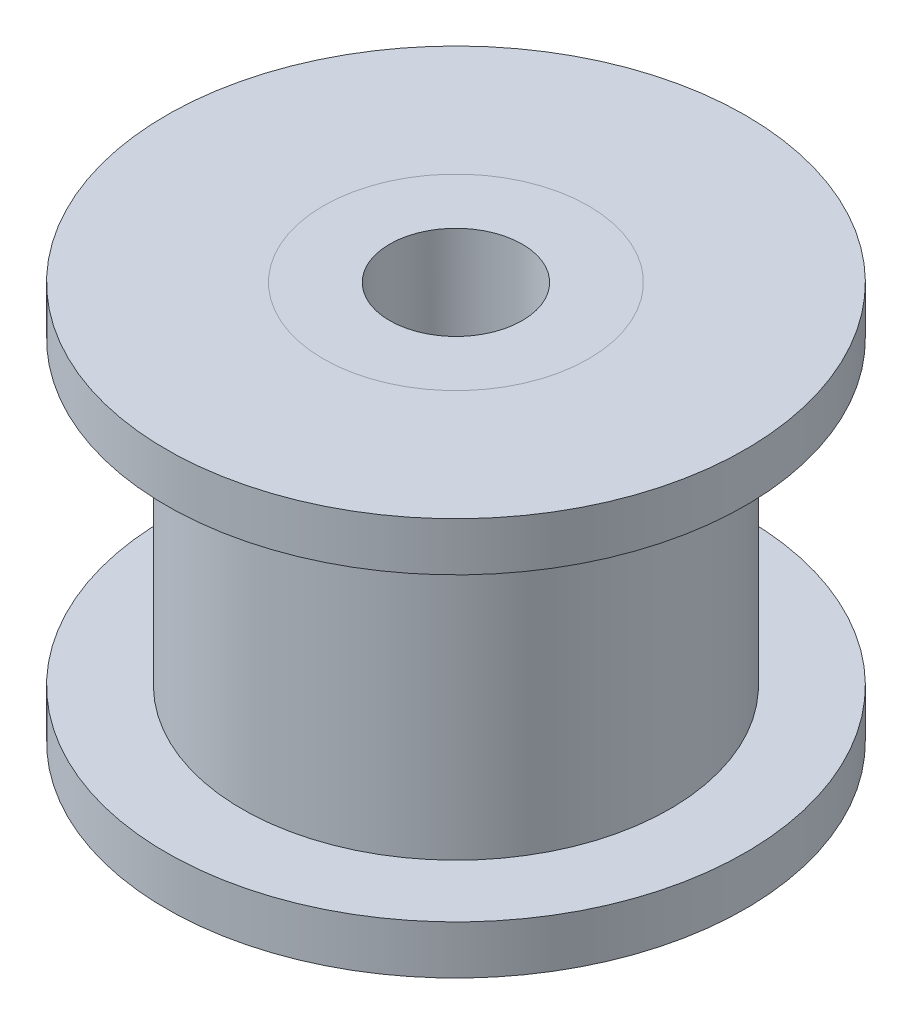
ISO-10303-21;
HEADER;
FILE_DESCRIPTION(('STEP AP214'),'2;1');
FILE_NAME('part.step','',(''),(''),'','','');
FILE_SCHEMA(('AUTOMOTIVE_DESIGN { 1 0 10303 214 1 1 1 1 }'));
ENDSEC;
DATA;
#1=APPLICATION_CONTEXT('core data for automotive mechanical design processes');
#2=APPLICATION_PROTOCOL_DEFINITION('international standard','automotive_design',2000,#1);
#3=PRODUCT_CONTEXT('',#1,'mechanical');
#4=PRODUCT('Part','Part','',(#3));
#5=PRODUCT_RELATED_PRODUCT_CATEGORY('part','',(#4));
#6=PRODUCT_DEFINITION_FORMATION('','',#4);
#7=PRODUCT_DEFINITION_CONTEXT('part definition',#1,'design');
#8=PRODUCT_DEFINITION('design','',#6,#7);
#9=PRODUCT_DEFINITION_SHAPE('','',#8);
#10=(LENGTH_UNIT() NAMED_UNIT(*) SI_UNIT(.MILLI.,.METRE.));
#11=(NAMED_UNIT(*) PLANE_ANGLE_UNIT() SI_UNIT($,.RADIAN.));
#12=(NAMED_UNIT(*) SI_UNIT($,.STERADIAN.) SOLID_ANGLE_UNIT());
#13=UNCERTAINTY_MEASURE_WITH_UNIT(LENGTH_MEASURE(1.E-05),#10,'distance_accuracy_value','');
#14=(GEOMETRIC_REPRESENTATION_CONTEXT(3) GLOBAL_UNCERTAINTY_ASSIGNED_CONTEXT((#13)) GLOBAL_UNIT_ASSIGNED_CONTEXT((#10,
#11,#12)) REPRESENTATION_CONTEXT('',''));
#15=CARTESIAN_POINT('',(0.,0.,0.));
#16=DIRECTION('',(0.,0.,1.));
#17=DIRECTION('',(1.,0.,0.));
#18=AXIS2_PLACEMENT_3D('',#15,#16,#17);
#19=CARTESIAN_POINT('',(0.,12.9852813742386,0.));
#20=DIRECTION('',(0.,-1.,0.));
#21=DIRECTION('',(0.,0.,1.));
#22=AXIS2_PLACEMENT_3D('',#19,#20,#21);
#23=CYLINDRICAL_SURFACE('',#22,3.);
#24=CARTESIAN_POINT('',(0.,1.5,0.));
#25=DIRECTION('',(0.,1.,0.));
#26=DIRECTION('',(0.,0.,1.));
#27=AXIS2_PLACEMENT_3D('',#24,#25,#26);
#28=CIRCLE('',#27,3.);
#29=CARTESIAN_POINT('',(0.,1.5,3.));
#30=VERTEX_POINT('',#29);
#31=EDGE_CURVE('E47',#30,#30,#28,.T.);
#32=ORIENTED_EDGE('',*,*,#31,.T.);
#33=EDGE_LOOP('',(#32));
#34=FACE_BOUND('',#33,.T.);
#35=CARTESIAN_POINT('',(0.,4.5,0.));
#36=DIRECTION('',(0.,-1.,0.));
#37=DIRECTION('',(0.,0.,-1.));
#38=AXIS2_PLACEMENT_3D('',#35,#36,#37);
#39=CIRCLE('',#38,3.);
#40=CARTESIAN_POINT('',(0.,4.5,-3.));
#41=VERTEX_POINT('',#40);
#42=EDGE_CURVE('E56',#41,#41,#39,.F.);
#43=ORIENTED_EDGE('',*,*,#42,.F.);
#44=EDGE_LOOP('',(#43));
#45=FACE_BOUND('',#44,.T.);
#46=ADVANCED_FACE('F40',(#34,#45),#23,.T.);
#47=CARTESIAN_POINT('',(0.,12.9852813742386,0.));
#48=DIRECTION('',(0.,-1.,0.));
#49=DIRECTION('',(0.,0.,1.));
#50=AXIS2_PLACEMENT_3D('',#47,#48,#49);
#51=CYLINDRICAL_SURFACE('',#50,1.5);
#52=CARTESIAN_POINT('',(0.,1.5,0.));
#53=DIRECTION('',(0.,1.,0.));
#54=DIRECTION('',(0.,0.,1.));
#55=AXIS2_PLACEMENT_3D('',#52,#53,#54);
#56=CIRCLE('',#55,1.5);
#57=CARTESIAN_POINT('',(0.,1.5,1.5));
#58=VERTEX_POINT('',#57);
#59=EDGE_CURVE('E51',#58,#58,#56,.T.);
#60=ORIENTED_EDGE('',*,*,#59,.F.);
#61=EDGE_LOOP('',(#60));
#62=FACE_BOUND('',#61,.T.);
#63=CARTESIAN_POINT('',(0.,4.5,0.));
#64=DIRECTION('',(0.,-1.,0.));
#65=DIRECTION('',(0.,0.,-1.));
#66=AXIS2_PLACEMENT_3D('',#63,#64,#65);
#67=CIRCLE('',#66,1.5);
#68=CARTESIAN_POINT('',(0.,4.5,-1.5));
#69=VERTEX_POINT('',#68);
#70=EDGE_CURVE('E11',#69,#69,#67,.F.);
#71=ORIENTED_EDGE('',*,*,#70,.T.);
#72=EDGE_LOOP('',(#71));
#73=FACE_BOUND('',#72,.T.);
#74=ADVANCED_FACE('F64',(#62,#73),#51,.F.);
#75=CARTESIAN_POINT('',(0.,1.5,0.));
#76=DIRECTION('',(0.,-1.,0.));
#77=DIRECTION('',(0.,0.,1.));
#78=AXIS2_PLACEMENT_3D('',#75,#76,#77);
#79=PLANE('',#78);
#80=ORIENTED_EDGE('',*,*,#59,.T.);
#81=EDGE_LOOP('',(#80));
#82=FACE_BOUND('',#81,.T.);
#83=ORIENTED_EDGE('',*,*,#31,.F.);
#84=EDGE_LOOP('',(#83));
#85=FACE_BOUND('',#84,.T.);
#86=ADVANCED_FACE('F69',(#82,#85),#79,.T.);
#87=CARTESIAN_POINT('',(3.,4.5,0.));
#88=DIRECTION('',(0.,1.,0.));
#89=DIRECTION('',(0.,0.,-1.));
#90=AXIS2_PLACEMENT_3D('',#87,#88,#89);
#91=PLANE('',#90);
#92=ORIENTED_EDGE('',*,*,#42,.T.);
#93=EDGE_LOOP('',(#92));
#94=FACE_BOUND('',#93,.T.);
#95=ORIENTED_EDGE('',*,*,#70,.F.);
#96=EDGE_LOOP('',(#95));
#97=FACE_BOUND('',#96,.T.);
#98=ADVANCED_FACE('F42',(#94,#97),#91,.T.);
#99=CLOSED_SHELL('',(#46,#74,#86,#98));
#100=MANIFOLD_SOLID_BREP('B2',#99);
#101=CARTESIAN_POINT('',(0.,-12.9852813742386,0.));
#102=DIRECTION('',(0.,1.,0.));
#103=DIRECTION('',(0.,0.,1.));
#104=AXIS2_PLACEMENT_3D('',#101,#102,#103);
#105=CYLINDRICAL_SURFACE('',#104,3.);
#106=CARTESIAN_POINT('',(0.,-1.5,0.));
#107=DIRECTION('',(0.,1.,0.));
#108=DIRECTION('',(0.,0.,1.));
#109=AXIS2_PLACEMENT_3D('',#106,#107,#108);
#110=CIRCLE('',#109,3.);
#111=CARTESIAN_POINT('',(0.,-1.5,3.));
#112=VERTEX_POINT('',#111);
#113=EDGE_CURVE('E116',#112,#112,#110,.T.);
#114=ORIENTED_EDGE('',*,*,#113,.F.);
#115=EDGE_LOOP('',(#114));
#116=FACE_BOUND('',#115,.T.);
#117=CARTESIAN_POINT('',(0.,-4.5,0.));
#118=DIRECTION('',(0.,-1.,0.));
#119=DIRECTION('',(0.,0.,-1.));
#120=AXIS2_PLACEMENT_3D('',#117,#118,#119);
#121=CIRCLE('',#120,3.);
#122=CARTESIAN_POINT('',(0.,-4.5,-3.));
#123=VERTEX_POINT('',#122);
#124=EDGE_CURVE('E125',#123,#123,#121,.F.);
#125=ORIENTED_EDGE('',*,*,#124,.T.);
#126=EDGE_LOOP('',(#125));
#127=FACE_BOUND('',#126,.T.);
#128=ADVANCED_FACE('F109',(#116,#127),#105,.T.);
#129=CARTESIAN_POINT('',(0.,-12.9852813742386,0.));
#130=DIRECTION('',(0.,1.,0.));
#131=DIRECTION('',(0.,0.,1.));
#132=AXIS2_PLACEMENT_3D('',#129,#130,#131);
#133=CYLINDRICAL_SURFACE('',#132,1.5);
#134=CARTESIAN_POINT('',(0.,-1.5,0.));
#135=DIRECTION('',(0.,1.,0.));
#136=DIRECTION('',(0.,0.,1.));
#137=AXIS2_PLACEMENT_3D('',#134,#135,#136);
#138=CIRCLE('',#137,1.5);
#139=CARTESIAN_POINT('',(0.,-1.5,1.5));
#140=VERTEX_POINT('',#139);
#141=EDGE_CURVE('E120',#140,#140,#138,.T.);
#142=ORIENTED_EDGE('',*,*,#141,.T.);
#143=EDGE_LOOP('',(#142));
#144=FACE_BOUND('',#143,.T.);
#145=CARTESIAN_POINT('',(0.,-4.5,0.));
#146=DIRECTION('',(0.,-1.,0.));
#147=DIRECTION('',(0.,0.,-1.));
#148=AXIS2_PLACEMENT_3D('',#145,#146,#147);
#149=CIRCLE('',#148,1.5);
#150=CARTESIAN_POINT('',(0.,-4.5,-1.5));
#151=VERTEX_POINT('',#150);
#152=EDGE_CURVE('E39',#151,#151,#149,.F.);
#153=ORIENTED_EDGE('',*,*,#152,.F.);
#154=EDGE_LOOP('',(#153));
#155=FACE_BOUND('',#154,.T.);
#156=ADVANCED_FACE('F136',(#144,#155),#133,.F.);
#157=CARTESIAN_POINT('',(0.,-1.5,0.));
#158=DIRECTION('',(0.,1.,0.));
#159=DIRECTION('',(0.,0.,1.));
#160=AXIS2_PLACEMENT_3D('',#157,#158,#159);
#161=PLANE('',#160);
#162=ORIENTED_EDGE('',*,*,#141,.F.);
#163=EDGE_LOOP('',(#162));
#164=FACE_BOUND('',#163,.T.);
#165=ORIENTED_EDGE('',*,*,#113,.T.);
#166=EDGE_LOOP('',(#165));
#167=FACE_BOUND('',#166,.T.);
#168=ADVANCED_FACE('F132',(#164,#167),#161,.T.);
#169=CARTESIAN_POINT('',(3.,-4.5,0.));
#170=DIRECTION('',(0.,-1.,0.));
#171=DIRECTION('',(0.,0.,-1.));
#172=AXIS2_PLACEMENT_3D('',#169,#170,#171);
#173=PLANE('',#172);
#174=ORIENTED_EDGE('',*,*,#124,.F.);
#175=EDGE_LOOP('',(#174));
#176=FACE_BOUND('',#175,.T.);
#177=ORIENTED_EDGE('',*,*,#152,.T.);
#178=EDGE_LOOP('',(#177));
#179=FACE_BOUND('',#178,.T.);
#180=ADVANCED_FACE('F111',(#176,#179),#173,.T.);
#181=CLOSED_SHELL('',(#128,#156,#168,#180));
#182=MANIFOLD_SOLID_BREP('B6',#181);
#183=CARTESIAN_POINT('',(0.,0.,0.));
#184=DIRECTION('',(0.,-1.,0.));
#185=DIRECTION('',(0.,0.,-1.));
#186=AXIS2_PLACEMENT_3D('',#183,#184,#185);
#187=CYLINDRICAL_SURFACE('',#186,2.);
#188=CARTESIAN_POINT('',(0.,-1.5,0.));
#189=DIRECTION('',(0.,-1.,0.));
#190=DIRECTION('',(0.,0.,-1.));
#191=AXIS2_PLACEMENT_3D('',#188,#189,#190);
#192=CIRCLE('',#191,2.);
#193=CARTESIAN_POINT('',(0.,-1.5,-2.));
#194=VERTEX_POINT('',#193);
#195=EDGE_CURVE('E108',#194,#194,#192,.T.);
#196=ORIENTED_EDGE('',*,*,#195,.T.);
#197=EDGE_LOOP('',(#196));
#198=FACE_BOUND('',#197,.T.);
#199=CARTESIAN_POINT('',(0.,1.5,0.));
#200=DIRECTION('',(0.,-1.,0.));
#201=DIRECTION('',(0.,0.,-1.));
#202=AXIS2_PLACEMENT_3D('',#199,#200,#201);
#203=CIRCLE('',#202,2.);
#204=CARTESIAN_POINT('',(0.,1.5,-2.));
#205=VERTEX_POINT('',#204);
#206=EDGE_CURVE('E211',#205,#205,#203,.T.);
#207=ORIENTED_EDGE('',*,*,#206,.F.);
#208=EDGE_LOOP('',(#207));
#209=FACE_BOUND('',#208,.T.);
#210=ADVANCED_FACE('F171',(#198,#209),#187,.F.);
#211=CARTESIAN_POINT('',(2.,-1.5,0.));
#212=DIRECTION('',(0.,-1.,0.));
#213=DIRECTION('',(0.,0.,-1.));
#214=AXIS2_PLACEMENT_3D('',#211,#212,#213);
#215=PLANE('',#214);
#216=CARTESIAN_POINT('',(0.,-1.5,0.));
#217=DIRECTION('',(0.,-1.,0.));
#218=DIRECTION('',(0.,0.,-1.));
#219=AXIS2_PLACEMENT_3D('',#216,#217,#218);
#220=CIRCLE('',#219,3.);
#221=CARTESIAN_POINT('',(0.,-1.5,-3.));
#222=VERTEX_POINT('',#221);
#223=EDGE_CURVE('E177',#222,#222,#220,.T.);
#224=ORIENTED_EDGE('',*,*,#223,.T.);
#225=EDGE_LOOP('',(#224));
#226=FACE_BOUND('',#225,.T.);
#227=ORIENTED_EDGE('',*,*,#195,.F.);
#228=EDGE_LOOP('',(#227));
#229=FACE_BOUND('',#228,.T.);
#230=ADVANCED_FACE('F219',(#226,#229),#215,.T.);
#231=CARTESIAN_POINT('',(0.,0.,0.));
#232=DIRECTION('',(0.,-1.,0.));
#233=DIRECTION('',(0.,0.,-1.));
#234=AXIS2_PLACEMENT_3D('',#231,#232,#233);
#235=CYLINDRICAL_SURFACE('',#234,3.);
#236=CARTESIAN_POINT('',(0.,-4.5,0.));
#237=DIRECTION('',(0.,-1.,0.));
#238=DIRECTION('',(0.,0.,-1.));
#239=AXIS2_PLACEMENT_3D('',#236,#237,#238);
#240=CIRCLE('',#239,3.);
#241=CARTESIAN_POINT('',(0.,-4.5,-3.));
#242=VERTEX_POINT('',#241);
#243=EDGE_CURVE('E181',#242,#242,#240,.T.);
#244=ORIENTED_EDGE('',*,*,#243,.T.);
#245=EDGE_LOOP('',(#244));
#246=FACE_BOUND('',#245,.T.);
#247=ORIENTED_EDGE('',*,*,#223,.F.);
#248=EDGE_LOOP('',(#247));
#249=FACE_BOUND('',#248,.T.);
#250=ADVANCED_FACE('F223',(#246,#249),#235,.F.);
#251=CARTESIAN_POINT('',(3.,-4.5,0.));
#252=DIRECTION('',(0.,-1.,0.));
#253=DIRECTION('',(0.,0.,-1.));
#254=AXIS2_PLACEMENT_3D('',#251,#252,#253);
#255=PLANE('',#254);
#256=CARTESIAN_POINT('',(0.,-4.5,0.));
#257=DIRECTION('',(0.,-1.,0.));
#258=DIRECTION('',(0.,0.,-1.));
#259=AXIS2_PLACEMENT_3D('',#256,#257,#258);
#260=CIRCLE('',#259,6.55);
#261=CARTESIAN_POINT('',(0.,-4.5,-6.55));
#262=VERTEX_POINT('',#261);
#263=EDGE_CURVE('E185',#262,#262,#260,.T.);
#264=ORIENTED_EDGE('',*,*,#263,.T.);
#265=EDGE_LOOP('',(#264));
#266=FACE_BOUND('',#265,.T.);
#267=ORIENTED_EDGE('',*,*,#243,.F.);
#268=EDGE_LOOP('',(#267));
#269=FACE_BOUND('',#268,.T.);
#270=ADVANCED_FACE('F227',(#266,#269),#255,.T.);
#271=CARTESIAN_POINT('',(0.,0.,0.));
#272=DIRECTION('',(0.,-1.,0.));
#273=DIRECTION('',(0.,0.,-1.));
#274=AXIS2_PLACEMENT_3D('',#271,#272,#273);
#275=CYLINDRICAL_SURFACE('',#274,6.55);
#276=CARTESIAN_POINT('',(0.,-3.4,0.));
#277=DIRECTION('',(0.,-1.,0.));
#278=DIRECTION('',(0.,0.,-1.));
#279=AXIS2_PLACEMENT_3D('',#276,#277,#278);
#280=CIRCLE('',#279,6.55);
#281=CARTESIAN_POINT('',(0.,-3.4,-6.55));
#282=VERTEX_POINT('',#281);
#283=EDGE_CURVE('E190',#282,#282,#280,.T.);
#284=ORIENTED_EDGE('',*,*,#283,.T.);
#285=EDGE_LOOP('',(#284));
#286=FACE_BOUND('',#285,.T.);
#287=ORIENTED_EDGE('',*,*,#263,.F.);
#288=EDGE_LOOP('',(#287));
#289=FACE_BOUND('',#288,.T.);
#290=ADVANCED_FACE('F234',(#286,#289),#275,.T.);
#291=CARTESIAN_POINT('',(6.55,-3.4,0.));
#292=DIRECTION('',(0.,1.,0.));
#293=DIRECTION('',(0.,0.,1.));
#294=AXIS2_PLACEMENT_3D('',#291,#292,#293);
#295=PLANE('',#294);
#296=CARTESIAN_POINT('',(0.,-3.4,0.));
#297=DIRECTION('',(0.,-1.,0.));
#298=DIRECTION('',(0.,0.,-1.));
#299=AXIS2_PLACEMENT_3D('',#296,#297,#298);
#300=CIRCLE('',#299,4.84);
#301=CARTESIAN_POINT('',(0.,-3.4,-4.84));
#302=VERTEX_POINT('',#301);
#303=EDGE_CURVE('E193',#302,#302,#300,.T.);
#304=ORIENTED_EDGE('',*,*,#303,.T.);
#305=EDGE_LOOP('',(#304));
#306=FACE_BOUND('',#305,.T.);
#307=ORIENTED_EDGE('',*,*,#283,.F.);
#308=EDGE_LOOP('',(#307));
#309=FACE_BOUND('',#308,.T.);
#310=ADVANCED_FACE('F238',(#306,#309),#295,.T.);
#311=CARTESIAN_POINT('',(0.,0.,0.));
#312=DIRECTION('',(0.,-1.,0.));
#313=DIRECTION('',(0.,0.,-1.));
#314=AXIS2_PLACEMENT_3D('',#311,#312,#313);
#315=CYLINDRICAL_SURFACE('',#314,4.84);
#316=CARTESIAN_POINT('',(0.,3.4,0.));
#317=DIRECTION('',(0.,-1.,0.));
#318=DIRECTION('',(0.,0.,-1.));
#319=AXIS2_PLACEMENT_3D('',#316,#317,#318);
#320=CIRCLE('',#319,4.84);
#321=CARTESIAN_POINT('',(0.,3.4,-4.84));
#322=VERTEX_POINT('',#321);
#323=EDGE_CURVE('E196',#322,#322,#320,.T.);
#324=ORIENTED_EDGE('',*,*,#323,.T.);
#325=EDGE_LOOP('',(#324));
#326=FACE_BOUND('',#325,.T.);
#327=ORIENTED_EDGE('',*,*,#303,.F.);
#328=EDGE_LOOP('',(#327));
#329=FACE_BOUND('',#328,.T.);
#330=ADVANCED_FACE('F242',(#326,#329),#315,.T.);
#331=CARTESIAN_POINT('',(6.55,3.4,0.));
#332=DIRECTION('',(0.,-1.,0.));
#333=DIRECTION('',(0.,0.,-1.));
#334=AXIS2_PLACEMENT_3D('',#331,#332,#333);
#335=PLANE('',#334);
#336=CARTESIAN_POINT('',(0.,3.4,0.));
#337=DIRECTION('',(0.,-1.,0.));
#338=DIRECTION('',(0.,0.,-1.));
#339=AXIS2_PLACEMENT_3D('',#336,#337,#338);
#340=CIRCLE('',#339,6.55);
#341=CARTESIAN_POINT('',(0.,3.4,-6.55));
#342=VERTEX_POINT('',#341);
#343=EDGE_CURVE('E199',#342,#342,#340,.T.);
#344=ORIENTED_EDGE('',*,*,#343,.T.);
#345=EDGE_LOOP('',(#344));
#346=FACE_BOUND('',#345,.T.);
#347=ORIENTED_EDGE('',*,*,#323,.F.);
#348=EDGE_LOOP('',(#347));
#349=FACE_BOUND('',#348,.T.);
#350=ADVANCED_FACE('F246',(#346,#349),#335,.T.);
#351=CARTESIAN_POINT('',(0.,0.,0.));
#352=DIRECTION('',(0.,-1.,0.));
#353=DIRECTION('',(0.,0.,-1.));
#354=AXIS2_PLACEMENT_3D('',#351,#352,#353);
#355=CYLINDRICAL_SURFACE('',#354,6.55);
#356=CARTESIAN_POINT('',(0.,4.5,0.));
#357=DIRECTION('',(0.,-1.,0.));
#358=DIRECTION('',(0.,0.,-1.));
#359=AXIS2_PLACEMENT_3D('',#356,#357,#358);
#360=CIRCLE('',#359,6.55);
#361=CARTESIAN_POINT('',(0.,4.5,-6.55));
#362=VERTEX_POINT('',#361);
#363=EDGE_CURVE('E202',#362,#362,#360,.T.);
#364=ORIENTED_EDGE('',*,*,#363,.T.);
#365=EDGE_LOOP('',(#364));
#366=FACE_BOUND('',#365,.T.);
#367=ORIENTED_EDGE('',*,*,#343,.F.);
#368=EDGE_LOOP('',(#367));
#369=FACE_BOUND('',#368,.T.);
#370=ADVANCED_FACE('F250',(#366,#369),#355,.T.);
#371=CARTESIAN_POINT('',(3.,4.5,0.));
#372=DIRECTION('',(0.,1.,0.));
#373=DIRECTION('',(0.,0.,1.));
#374=AXIS2_PLACEMENT_3D('',#371,#372,#373);
#375=PLANE('',#374);
#376=CARTESIAN_POINT('',(0.,4.5,0.));
#377=DIRECTION('',(0.,-1.,0.));
#378=DIRECTION('',(0.,0.,-1.));
#379=AXIS2_PLACEMENT_3D('',#376,#377,#378);
#380=CIRCLE('',#379,3.);
#381=CARTESIAN_POINT('',(0.,4.5,-3.));
#382=VERTEX_POINT('',#381);
#383=EDGE_CURVE('E205',#382,#382,#380,.T.);
#384=ORIENTED_EDGE('',*,*,#383,.T.);
#385=EDGE_LOOP('',(#384));
#386=FACE_BOUND('',#385,.T.);
#387=ORIENTED_EDGE('',*,*,#363,.F.);
#388=EDGE_LOOP('',(#387));
#389=FACE_BOUND('',#388,.T.);
#390=ADVANCED_FACE('F254',(#386,#389),#375,.T.);
#391=CARTESIAN_POINT('',(0.,0.,0.));
#392=DIRECTION('',(0.,-1.,0.));
#393=DIRECTION('',(0.,0.,-1.));
#394=AXIS2_PLACEMENT_3D('',#391,#392,#393);
#395=CYLINDRICAL_SURFACE('',#394,3.);
#396=CARTESIAN_POINT('',(0.,1.5,0.));
#397=DIRECTION('',(0.,-1.,0.));
#398=DIRECTION('',(0.,0.,-1.));
#399=AXIS2_PLACEMENT_3D('',#396,#397,#398);
#400=CIRCLE('',#399,3.);
#401=CARTESIAN_POINT('',(0.,1.5,-3.));
#402=VERTEX_POINT('',#401);
#403=EDGE_CURVE('E208',#402,#402,#400,.T.);
#404=ORIENTED_EDGE('',*,*,#403,.T.);
#405=EDGE_LOOP('',(#404));
#406=FACE_BOUND('',#405,.T.);
#407=ORIENTED_EDGE('',*,*,#383,.F.);
#408=EDGE_LOOP('',(#407));
#409=FACE_BOUND('',#408,.T.);
#410=ADVANCED_FACE('F258',(#406,#409),#395,.F.);
#411=CARTESIAN_POINT('',(2.,1.5,0.));
#412=DIRECTION('',(0.,1.,0.));
#413=DIRECTION('',(0.,0.,1.));
#414=AXIS2_PLACEMENT_3D('',#411,#412,#413);
#415=PLANE('',#414);
#416=ORIENTED_EDGE('',*,*,#206,.T.);
#417=EDGE_LOOP('',(#416));
#418=FACE_BOUND('',#417,.T.);
#419=ORIENTED_EDGE('',*,*,#403,.F.);
#420=EDGE_LOOP('',(#419));
#421=FACE_BOUND('',#420,.T.);
#422=ADVANCED_FACE('F215',(#418,#421),#415,.T.);
#423=CLOSED_SHELL('',(#210,#230,#250,#270,#290,#310,#330,#350,#370,#390,#410,#422));
#424=MANIFOLD_SOLID_BREP('B34',#423);
#425=ADVANCED_BREP_SHAPE_REPRESENTATION('',(#18,#100,#182,#424),#14);
#426=SHAPE_DEFINITION_REPRESENTATION(#9,#425);
ENDSEC;
END-ISO-10303-21;
